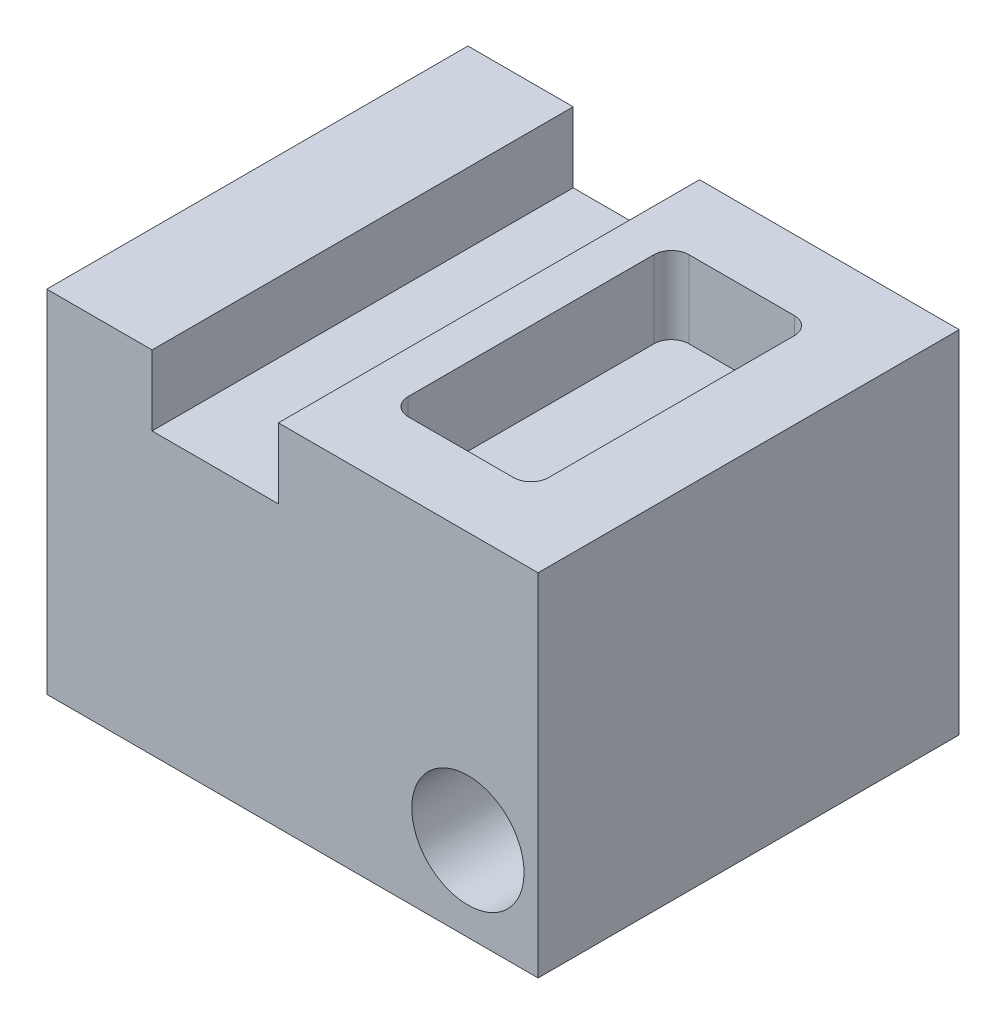
ISO-10303-21;
HEADER;
FILE_DESCRIPTION(('STEP AP214'),'2;1');
FILE_NAME('part.step','',(''),(''),'','','');
FILE_SCHEMA(('AUTOMOTIVE_DESIGN { 1 0 10303 214 1 1 1 1 }'));
ENDSEC;
DATA;
#1=APPLICATION_CONTEXT('core data for automotive mechanical design processes');
#2=APPLICATION_PROTOCOL_DEFINITION('international standard','automotive_design',2000,#1);
#3=PRODUCT_CONTEXT('',#1,'mechanical');
#4=PRODUCT('Part','Part','',(#3));
#5=PRODUCT_RELATED_PRODUCT_CATEGORY('part','',(#4));
#6=PRODUCT_DEFINITION_FORMATION('','',#4);
#7=PRODUCT_DEFINITION_CONTEXT('part definition',#1,'design');
#8=PRODUCT_DEFINITION('design','',#6,#7);
#9=PRODUCT_DEFINITION_SHAPE('','',#8);
#10=(LENGTH_UNIT() NAMED_UNIT(*) SI_UNIT(.MILLI.,.METRE.));
#11=(NAMED_UNIT(*) PLANE_ANGLE_UNIT() SI_UNIT($,.RADIAN.));
#12=(NAMED_UNIT(*) SI_UNIT($,.STERADIAN.) SOLID_ANGLE_UNIT());
#13=UNCERTAINTY_MEASURE_WITH_UNIT(LENGTH_MEASURE(1.E-05),#10,'distance_accuracy_value','');
#14=(GEOMETRIC_REPRESENTATION_CONTEXT(3) GLOBAL_UNCERTAINTY_ASSIGNED_CONTEXT((#13)) GLOBAL_UNIT_ASSIGNED_CONTEXT((#10,
#11,#12)) REPRESENTATION_CONTEXT('',''));
#15=CARTESIAN_POINT('',(0.,0.,0.));
#16=DIRECTION('',(0.,0.,1.));
#17=DIRECTION('',(1.,0.,0.));
#18=AXIS2_PLACEMENT_3D('',#15,#16,#17);
#19=CARTESIAN_POINT('',(0.,50.,-60.));
#20=DIRECTION('',(0.,1.,0.));
#21=DIRECTION('',(0.,0.,1.));
#22=AXIS2_PLACEMENT_3D('',#19,#20,#21);
#23=PLANE('',#22);
#24=DIRECTION('',(-1.,0.,0.));
#25=VECTOR('',#24,1.);
#26=CARTESIAN_POINT('',(0.,50.,0.));
#27=LINE('',#26,#25);
#28=CARTESIAN_POINT('',(15.,50.,0.));
#29=VERTEX_POINT('',#28);
#30=CARTESIAN_POINT('',(0.,50.,0.));
#31=VERTEX_POINT('',#30);
#32=EDGE_CURVE('E268',#29,#31,#27,.T.);
#33=ORIENTED_EDGE('',*,*,#32,.F.);
#34=DIRECTION('',(0.,0.,-1.));
#35=VECTOR('',#34,1.);
#36=CARTESIAN_POINT('',(15.,50.,0.999999999999999));
#37=LINE('',#36,#35);
#38=CARTESIAN_POINT('',(15.,50.,-60.));
#39=VERTEX_POINT('',#38);
#40=EDGE_CURVE('E50',#29,#39,#37,.T.);
#41=ORIENTED_EDGE('',*,*,#40,.T.);
#42=DIRECTION('',(-1.,0.,0.));
#43=VECTOR('',#42,1.);
#44=CARTESIAN_POINT('',(0.,50.,-60.));
#45=LINE('',#44,#43);
#46=CARTESIAN_POINT('',(0.,50.,-60.));
#47=VERTEX_POINT('',#46);
#48=EDGE_CURVE('E169',#39,#47,#45,.T.);
#49=ORIENTED_EDGE('',*,*,#48,.T.);
#50=DIRECTION('',(0.,0.,1.));
#51=VECTOR('',#50,1.);
#52=CARTESIAN_POINT('',(0.,50.,-60.));
#53=LINE('',#52,#51);
#54=EDGE_CURVE('E11',#47,#31,#53,.T.);
#55=ORIENTED_EDGE('',*,*,#54,.T.);
#56=EDGE_LOOP('',(#33,#41,#49,#55));
#57=FACE_BOUND('',#56,.T.);
#58=ADVANCED_FACE('F33',(#57),#23,.T.);
#59=CARTESIAN_POINT('',(0.,0.,-60.));
#60=DIRECTION('',(-1.,0.,0.));
#61=DIRECTION('',(0.,0.,1.));
#62=AXIS2_PLACEMENT_3D('',#59,#60,#61);
#63=PLANE('',#62);
#64=DIRECTION('',(0.,-1.,0.));
#65=VECTOR('',#64,1.);
#66=CARTESIAN_POINT('',(0.,0.,0.));
#67=LINE('',#66,#65);
#68=CARTESIAN_POINT('',(0.,0.,0.));
#69=VERTEX_POINT('',#68);
#70=EDGE_CURVE('E246',#31,#69,#67,.T.);
#71=ORIENTED_EDGE('',*,*,#70,.F.);
#72=ORIENTED_EDGE('',*,*,#54,.F.);
#73=DIRECTION('',(0.,-1.,0.));
#74=VECTOR('',#73,1.);
#75=CARTESIAN_POINT('',(0.,0.,-60.));
#76=LINE('',#75,#74);
#77=CARTESIAN_POINT('',(0.,0.,-60.));
#78=VERTEX_POINT('',#77);
#79=EDGE_CURVE('E247',#47,#78,#76,.T.);
#80=ORIENTED_EDGE('',*,*,#79,.T.);
#81=DIRECTION('',(0.,0.,1.));
#82=VECTOR('',#81,1.);
#83=CARTESIAN_POINT('',(0.,0.,-60.));
#84=LINE('',#83,#82);
#85=EDGE_CURVE('E37',#78,#69,#84,.T.);
#86=ORIENTED_EDGE('',*,*,#85,.T.);
#87=EDGE_LOOP('',(#71,#72,#80,#86));
#88=FACE_BOUND('',#87,.T.);
#89=ADVANCED_FACE('F35',(#88),#63,.T.);
#90=DIRECTION('',(0.,0.,-1.));
#91=VECTOR('',#90,1.);
#92=CARTESIAN_POINT('',(33.,50.,0.999999999999999));
#93=LINE('',#92,#91);
#94=CARTESIAN_POINT('',(33.,50.,0.));
#95=VERTEX_POINT('',#94);
#96=CARTESIAN_POINT('',(33.,50.,-60.));
#97=VERTEX_POINT('',#96);
#98=EDGE_CURVE('E174',#95,#97,#93,.T.);
#99=ORIENTED_EDGE('',*,*,#98,.F.);
#100=CARTESIAN_POINT('',(70.,50.,0.));
#101=VERTEX_POINT('',#100);
#102=EDGE_CURVE('E251',#101,#95,#27,.T.);
#103=ORIENTED_EDGE('',*,*,#102,.F.);
#104=DIRECTION('',(0.,0.,1.));
#105=VECTOR('',#104,1.);
#106=CARTESIAN_POINT('',(70.,50.,-60.));
#107=LINE('',#106,#105);
#108=CARTESIAN_POINT('',(70.,50.,-60.));
#109=VERTEX_POINT('',#108);
#110=EDGE_CURVE('E42',#109,#101,#107,.T.);
#111=ORIENTED_EDGE('',*,*,#110,.F.);
#112=EDGE_CURVE('E257',#109,#97,#45,.T.);
#113=ORIENTED_EDGE('',*,*,#112,.T.);
#114=EDGE_LOOP('',(#99,#103,#111,#113));
#115=FACE_BOUND('',#114,.T.);
#116=CARTESIAN_POINT('',(41.5,50.,-12.5));
#117=DIRECTION('',(0.,1.,0.));
#118=DIRECTION('',(0.,0.,1.));
#119=AXIS2_PLACEMENT_3D('',#116,#117,#118);
#120=CIRCLE('',#119,2.5);
#121=CARTESIAN_POINT('',(39.,50.,-12.5));
#122=VERTEX_POINT('',#121);
#123=CARTESIAN_POINT('',(41.5,50.,-10.));
#124=VERTEX_POINT('',#123);
#125=EDGE_CURVE('E58',#122,#124,#120,.T.);
#126=ORIENTED_EDGE('',*,*,#125,.F.);
#127=DIRECTION('',(0.,0.,1.));
#128=VECTOR('',#127,1.);
#129=CARTESIAN_POINT('',(39.,50.,-47.5));
#130=LINE('',#129,#128);
#131=CARTESIAN_POINT('',(39.,50.,-47.5));
#132=VERTEX_POINT('',#131);
#133=EDGE_CURVE('E182',#132,#122,#130,.T.);
#134=ORIENTED_EDGE('',*,*,#133,.F.);
#135=CARTESIAN_POINT('',(41.5,50.,-47.5));
#136=DIRECTION('',(0.,1.,0.));
#137=DIRECTION('',(0.,0.,1.));
#138=AXIS2_PLACEMENT_3D('',#135,#136,#137);
#139=CIRCLE('',#138,2.5);
#140=CARTESIAN_POINT('',(41.5,50.,-50.));
#141=VERTEX_POINT('',#140);
#142=EDGE_CURVE('E220',#141,#132,#139,.T.);
#143=ORIENTED_EDGE('',*,*,#142,.F.);
#144=DIRECTION('',(-1.,0.,0.));
#145=VECTOR('',#144,1.);
#146=CARTESIAN_POINT('',(41.5,50.,-50.));
#147=LINE('',#146,#145);
#148=CARTESIAN_POINT('',(56.5,50.,-50.));
#149=VERTEX_POINT('',#148);
#150=EDGE_CURVE('E217',#149,#141,#147,.T.);
#151=ORIENTED_EDGE('',*,*,#150,.F.);
#152=CARTESIAN_POINT('',(56.5,50.,-47.5));
#153=DIRECTION('',(0.,1.,0.));
#154=DIRECTION('',(0.,0.,-1.));
#155=AXIS2_PLACEMENT_3D('',#152,#153,#154);
#156=CIRCLE('',#155,2.5);
#157=CARTESIAN_POINT('',(59.,50.,-47.5));
#158=VERTEX_POINT('',#157);
#159=EDGE_CURVE('E214',#158,#149,#156,.T.);
#160=ORIENTED_EDGE('',*,*,#159,.F.);
#161=DIRECTION('',(0.,0.,-1.));
#162=VECTOR('',#161,1.);
#163=CARTESIAN_POINT('',(59.,50.,-47.5));
#164=LINE('',#163,#162);
#165=CARTESIAN_POINT('',(59.,50.,-12.5));
#166=VERTEX_POINT('',#165);
#167=EDGE_CURVE('E211',#166,#158,#164,.T.);
#168=ORIENTED_EDGE('',*,*,#167,.F.);
#169=CARTESIAN_POINT('',(56.5,50.,-12.5));
#170=DIRECTION('',(0.,1.,0.));
#171=DIRECTION('',(0.,0.,1.));
#172=AXIS2_PLACEMENT_3D('',#169,#170,#171);
#173=CIRCLE('',#172,2.5);
#174=CARTESIAN_POINT('',(56.5,50.,-10.));
#175=VERTEX_POINT('',#174);
#176=EDGE_CURVE('E208',#175,#166,#173,.T.);
#177=ORIENTED_EDGE('',*,*,#176,.F.);
#178=DIRECTION('',(1.,0.,0.));
#179=VECTOR('',#178,1.);
#180=CARTESIAN_POINT('',(41.5,50.,-10.));
#181=LINE('',#180,#179);
#182=EDGE_CURVE('E205',#124,#175,#181,.T.);
#183=ORIENTED_EDGE('',*,*,#182,.F.);
#184=EDGE_LOOP('',(#126,#134,#143,#151,#160,#168,#177,#183));
#185=FACE_BOUND('',#184,.T.);
#186=ADVANCED_FACE('F292',(#115,#185),#23,.T.);
#187=CARTESIAN_POINT('',(70.,0.,-60.));
#188=DIRECTION('',(1.,0.,0.));
#189=DIRECTION('',(0.,0.,-1.));
#190=AXIS2_PLACEMENT_3D('',#187,#188,#189);
#191=PLANE('',#190);
#192=DIRECTION('',(0.,1.,0.));
#193=VECTOR('',#192,1.);
#194=CARTESIAN_POINT('',(70.,0.,0.));
#195=LINE('',#194,#193);
#196=CARTESIAN_POINT('',(70.,0.,0.));
#197=VERTEX_POINT('',#196);
#198=EDGE_CURVE('E265',#197,#101,#195,.T.);
#199=ORIENTED_EDGE('',*,*,#198,.F.);
#200=DIRECTION('',(0.,0.,1.));
#201=VECTOR('',#200,1.);
#202=CARTESIAN_POINT('',(70.,0.,-60.));
#203=LINE('',#202,#201);
#204=CARTESIAN_POINT('',(70.,0.,-60.));
#205=VERTEX_POINT('',#204);
#206=EDGE_CURVE('E271',#205,#197,#203,.T.);
#207=ORIENTED_EDGE('',*,*,#206,.F.);
#208=DIRECTION('',(0.,1.,0.));
#209=VECTOR('',#208,1.);
#210=CARTESIAN_POINT('',(70.,0.,-60.));
#211=LINE('',#210,#209);
#212=EDGE_CURVE('E254',#205,#109,#211,.T.);
#213=ORIENTED_EDGE('',*,*,#212,.T.);
#214=ORIENTED_EDGE('',*,*,#110,.T.);
#215=EDGE_LOOP('',(#199,#207,#213,#214));
#216=FACE_BOUND('',#215,.T.);
#217=ADVANCED_FACE('F287',(#216),#191,.T.);
#218=CARTESIAN_POINT('',(0.,0.,-60.));
#219=DIRECTION('',(0.,-1.,0.));
#220=DIRECTION('',(0.,0.,-1.));
#221=AXIS2_PLACEMENT_3D('',#218,#219,#220);
#222=PLANE('',#221);
#223=DIRECTION('',(1.,0.,0.));
#224=VECTOR('',#223,1.);
#225=CARTESIAN_POINT('',(0.,0.,0.));
#226=LINE('',#225,#224);
#227=EDGE_CURVE('E262',#69,#197,#226,.T.);
#228=ORIENTED_EDGE('',*,*,#227,.F.);
#229=ORIENTED_EDGE('',*,*,#85,.F.);
#230=DIRECTION('',(1.,0.,0.));
#231=VECTOR('',#230,1.);
#232=CARTESIAN_POINT('',(0.,0.,-60.));
#233=LINE('',#232,#231);
#234=EDGE_CURVE('E250',#78,#205,#233,.T.);
#235=ORIENTED_EDGE('',*,*,#234,.T.);
#236=ORIENTED_EDGE('',*,*,#206,.T.);
#237=EDGE_LOOP('',(#228,#229,#235,#236));
#238=FACE_BOUND('',#237,.T.);
#239=ADVANCED_FACE('F279',(#238),#222,.T.);
#240=CARTESIAN_POINT('',(0.,0.,-60.));
#241=DIRECTION('',(0.,0.,-1.));
#242=DIRECTION('',(-1.,0.,0.));
#243=AXIS2_PLACEMENT_3D('',#240,#241,#242);
#244=PLANE('',#243);
#245=DIRECTION('',(0.,1.,0.));
#246=VECTOR('',#245,1.);
#247=CARTESIAN_POINT('',(15.,50.,-60.));
#248=LINE('',#247,#246);
#249=CARTESIAN_POINT('',(15.,40.,-60.));
#250=VERTEX_POINT('',#249);
#251=EDGE_CURVE('E150',#250,#39,#248,.T.);
#252=ORIENTED_EDGE('',*,*,#251,.F.);
#253=DIRECTION('',(-1.,0.,0.));
#254=VECTOR('',#253,1.);
#255=CARTESIAN_POINT('',(15.,40.,-60.));
#256=LINE('',#255,#254);
#257=CARTESIAN_POINT('',(33.,40.,-60.));
#258=VERTEX_POINT('',#257);
#259=EDGE_CURVE('E157',#258,#250,#256,.T.);
#260=ORIENTED_EDGE('',*,*,#259,.F.);
#261=DIRECTION('',(0.,-1.,0.));
#262=VECTOR('',#261,1.);
#263=CARTESIAN_POINT('',(33.,50.,-60.));
#264=LINE('',#263,#262);
#265=EDGE_CURVE('E164',#97,#258,#264,.T.);
#266=ORIENTED_EDGE('',*,*,#265,.F.);
#267=ORIENTED_EDGE('',*,*,#112,.F.);
#268=ORIENTED_EDGE('',*,*,#212,.F.);
#269=ORIENTED_EDGE('',*,*,#234,.F.);
#270=ORIENTED_EDGE('',*,*,#79,.F.);
#271=ORIENTED_EDGE('',*,*,#48,.F.);
#272=EDGE_LOOP('',(#252,#260,#266,#267,#268,#269,#270,#271));
#273=FACE_BOUND('',#272,.T.);
#274=ADVANCED_FACE('F167',(#273),#244,.T.);
#275=CARTESIAN_POINT('',(0.,0.,0.));
#276=DIRECTION('',(0.,0.,-1.));
#277=DIRECTION('',(-1.,0.,0.));
#278=AXIS2_PLACEMENT_3D('',#275,#276,#277);
#279=PLANE('',#278);
#280=CARTESIAN_POINT('',(60.,12.,0.));
#281=DIRECTION('',(0.,0.,1.));
#282=DIRECTION('',(1.,0.,0.));
#283=AXIS2_PLACEMENT_3D('',#280,#281,#282);
#284=CIRCLE('',#283,7.99999999999998);
#285=CARTESIAN_POINT('',(68.,12.,0.));
#286=VERTEX_POINT('',#285);
#287=EDGE_CURVE('E227',#286,#286,#284,.T.);
#288=ORIENTED_EDGE('',*,*,#287,.F.);
#289=EDGE_LOOP('',(#288));
#290=FACE_BOUND('',#289,.T.);
#291=ORIENTED_EDGE('',*,*,#102,.T.);
#292=DIRECTION('',(0.,-1.,0.));
#293=VECTOR('',#292,1.);
#294=CARTESIAN_POINT('',(33.,50.,0.));
#295=LINE('',#294,#293);
#296=CARTESIAN_POINT('',(33.,40.,0.));
#297=VERTEX_POINT('',#296);
#298=EDGE_CURVE('E176',#95,#297,#295,.T.);
#299=ORIENTED_EDGE('',*,*,#298,.T.);
#300=DIRECTION('',(-1.,0.,0.));
#301=VECTOR('',#300,1.);
#302=CARTESIAN_POINT('',(15.,40.,0.));
#303=LINE('',#302,#301);
#304=CARTESIAN_POINT('',(15.,40.,0.));
#305=VERTEX_POINT('',#304);
#306=EDGE_CURVE('E154',#297,#305,#303,.T.);
#307=ORIENTED_EDGE('',*,*,#306,.T.);
#308=DIRECTION('',(0.,1.,0.));
#309=VECTOR('',#308,1.);
#310=CARTESIAN_POINT('',(15.,50.,0.));
#311=LINE('',#310,#309);
#312=EDGE_CURVE('E151',#305,#29,#311,.T.);
#313=ORIENTED_EDGE('',*,*,#312,.T.);
#314=ORIENTED_EDGE('',*,*,#32,.T.);
#315=ORIENTED_EDGE('',*,*,#70,.T.);
#316=ORIENTED_EDGE('',*,*,#227,.T.);
#317=ORIENTED_EDGE('',*,*,#198,.T.);
#318=EDGE_LOOP('',(#291,#299,#307,#313,#314,#315,#316,#317));
#319=FACE_BOUND('',#318,.T.);
#320=ADVANCED_FACE('F281',(#290,#319),#279,.F.);
#321=CARTESIAN_POINT('',(60.,12.,-22.));
#322=DIRECTION('',(0.,0.,-1.));
#323=DIRECTION('',(-1.,0.,0.));
#324=AXIS2_PLACEMENT_3D('',#321,#322,#323);
#325=PLANE('',#324);
#326=CARTESIAN_POINT('',(60.,12.,-22.));
#327=DIRECTION('',(0.,0.,1.));
#328=DIRECTION('',(1.,0.,0.));
#329=AXIS2_PLACEMENT_3D('',#326,#327,#328);
#330=CIRCLE('',#329,7.99999999999998);
#331=CARTESIAN_POINT('',(68.,12.,-22.));
#332=VERTEX_POINT('',#331);
#333=EDGE_CURVE('E243',#332,#332,#330,.T.);
#334=ORIENTED_EDGE('',*,*,#333,.T.);
#335=EDGE_LOOP('',(#334));
#336=FACE_BOUND('',#335,.T.);
#337=ADVANCED_FACE('F331',(#336),#325,.F.);
#338=CARTESIAN_POINT('',(60.,12.,0.));
#339=DIRECTION('',(0.,0.,1.));
#340=DIRECTION('',(1.,0.,0.));
#341=AXIS2_PLACEMENT_3D('',#338,#339,#340);
#342=CYLINDRICAL_SURFACE('',#341,7.99999999999998);
#343=ORIENTED_EDGE('',*,*,#333,.F.);
#344=EDGE_LOOP('',(#343));
#345=FACE_BOUND('',#344,.T.);
#346=ORIENTED_EDGE('',*,*,#287,.T.);
#347=EDGE_LOOP('',(#346));
#348=FACE_BOUND('',#347,.T.);
#349=ADVANCED_FACE('F336',(#345,#348),#342,.F.);
#350=CARTESIAN_POINT('',(41.5,39.,-12.5));
#351=DIRECTION('',(0.,1.,0.));
#352=DIRECTION('',(0.,0.,1.));
#353=AXIS2_PLACEMENT_3D('',#350,#351,#352);
#354=CYLINDRICAL_SURFACE('',#353,2.5);
#355=ORIENTED_EDGE('',*,*,#125,.T.);
#356=DIRECTION('',(0.,1.,0.));
#357=VECTOR('',#356,1.);
#358=CARTESIAN_POINT('',(41.5,39.,-10.));
#359=LINE('',#358,#357);
#360=CARTESIAN_POINT('',(41.5,39.,-10.));
#361=VERTEX_POINT('',#360);
#362=EDGE_CURVE('E203',#361,#124,#359,.T.);
#363=ORIENTED_EDGE('',*,*,#362,.F.);
#364=CARTESIAN_POINT('',(41.5,39.,-12.5));
#365=DIRECTION('',(0.,1.,0.));
#366=DIRECTION('',(0.,0.,1.));
#367=AXIS2_PLACEMENT_3D('',#364,#365,#366);
#368=CIRCLE('',#367,2.5);
#369=CARTESIAN_POINT('',(39.,39.,-12.5));
#370=VERTEX_POINT('',#369);
#371=EDGE_CURVE('E178',#370,#361,#368,.T.);
#372=ORIENTED_EDGE('',*,*,#371,.F.);
#373=DIRECTION('',(0.,1.,0.));
#374=VECTOR('',#373,1.);
#375=CARTESIAN_POINT('',(39.,39.,-12.5));
#376=LINE('',#375,#374);
#377=EDGE_CURVE('E225',#370,#122,#376,.T.);
#378=ORIENTED_EDGE('',*,*,#377,.T.);
#379=EDGE_LOOP('',(#355,#363,#372,#378));
#380=FACE_BOUND('',#379,.T.);
#381=ADVANCED_FACE('F340',(#380),#354,.F.);
#382=CARTESIAN_POINT('',(39.,39.,-47.5));
#383=DIRECTION('',(-1.,0.,0.));
#384=DIRECTION('',(0.,0.,1.));
#385=AXIS2_PLACEMENT_3D('',#382,#383,#384);
#386=PLANE('',#385);
#387=ORIENTED_EDGE('',*,*,#133,.T.);
#388=ORIENTED_EDGE('',*,*,#377,.F.);
#389=DIRECTION('',(0.,0.,1.));
#390=VECTOR('',#389,1.);
#391=CARTESIAN_POINT('',(39.,39.,-47.5));
#392=LINE('',#391,#390);
#393=CARTESIAN_POINT('',(39.,39.,-47.5));
#394=VERTEX_POINT('',#393);
#395=EDGE_CURVE('E200',#394,#370,#392,.T.);
#396=ORIENTED_EDGE('',*,*,#395,.F.);
#397=DIRECTION('',(0.,1.,0.));
#398=VECTOR('',#397,1.);
#399=CARTESIAN_POINT('',(39.,39.,-47.5));
#400=LINE('',#399,#398);
#401=EDGE_CURVE('E228',#394,#132,#400,.T.);
#402=ORIENTED_EDGE('',*,*,#401,.T.);
#403=EDGE_LOOP('',(#387,#388,#396,#402));
#404=FACE_BOUND('',#403,.T.);
#405=ADVANCED_FACE('F344',(#404),#386,.F.);
#406=CARTESIAN_POINT('',(41.5,39.,-47.5));
#407=DIRECTION('',(0.,1.,0.));
#408=DIRECTION('',(0.,0.,1.));
#409=AXIS2_PLACEMENT_3D('',#406,#407,#408);
#410=CYLINDRICAL_SURFACE('',#409,2.5);
#411=ORIENTED_EDGE('',*,*,#142,.T.);
#412=ORIENTED_EDGE('',*,*,#401,.F.);
#413=CARTESIAN_POINT('',(41.5,39.,-47.5));
#414=DIRECTION('',(0.,1.,0.));
#415=DIRECTION('',(0.,0.,1.));
#416=AXIS2_PLACEMENT_3D('',#413,#414,#415);
#417=CIRCLE('',#416,2.5);
#418=CARTESIAN_POINT('',(41.5,39.,-50.));
#419=VERTEX_POINT('',#418);
#420=EDGE_CURVE('E197',#419,#394,#417,.T.);
#421=ORIENTED_EDGE('',*,*,#420,.F.);
#422=DIRECTION('',(0.,1.,0.));
#423=VECTOR('',#422,1.);
#424=CARTESIAN_POINT('',(41.5,39.,-50.));
#425=LINE('',#424,#423);
#426=EDGE_CURVE('E230',#419,#141,#425,.T.);
#427=ORIENTED_EDGE('',*,*,#426,.T.);
#428=EDGE_LOOP('',(#411,#412,#421,#427));
#429=FACE_BOUND('',#428,.T.);
#430=ADVANCED_FACE('F363',(#429),#410,.F.);
#431=CARTESIAN_POINT('',(41.5,39.,-50.));
#432=DIRECTION('',(0.,0.,-1.));
#433=DIRECTION('',(-1.,0.,0.));
#434=AXIS2_PLACEMENT_3D('',#431,#432,#433);
#435=PLANE('',#434);
#436=ORIENTED_EDGE('',*,*,#150,.T.);
#437=ORIENTED_EDGE('',*,*,#426,.F.);
#438=DIRECTION('',(-1.,0.,0.));
#439=VECTOR('',#438,1.);
#440=CARTESIAN_POINT('',(41.5,39.,-50.));
#441=LINE('',#440,#439);
#442=CARTESIAN_POINT('',(56.5,39.,-50.));
#443=VERTEX_POINT('',#442);
#444=EDGE_CURVE('E194',#443,#419,#441,.T.);
#445=ORIENTED_EDGE('',*,*,#444,.F.);
#446=DIRECTION('',(0.,1.,0.));
#447=VECTOR('',#446,1.);
#448=CARTESIAN_POINT('',(56.5,39.,-50.));
#449=LINE('',#448,#447);
#450=EDGE_CURVE('E232',#443,#149,#449,.T.);
#451=ORIENTED_EDGE('',*,*,#450,.T.);
#452=EDGE_LOOP('',(#436,#437,#445,#451));
#453=FACE_BOUND('',#452,.T.);
#454=ADVANCED_FACE('F359',(#453),#435,.F.);
#455=CARTESIAN_POINT('',(56.5,39.,-47.5));
#456=DIRECTION('',(0.,1.,0.));
#457=DIRECTION('',(0.,0.,1.));
#458=AXIS2_PLACEMENT_3D('',#455,#456,#457);
#459=CYLINDRICAL_SURFACE('',#458,2.5);
#460=ORIENTED_EDGE('',*,*,#159,.T.);
#461=ORIENTED_EDGE('',*,*,#450,.F.);
#462=CARTESIAN_POINT('',(56.5,39.,-47.5));
#463=DIRECTION('',(0.,1.,0.));
#464=DIRECTION('',(0.,0.,-1.));
#465=AXIS2_PLACEMENT_3D('',#462,#463,#464);
#466=CIRCLE('',#465,2.5);
#467=CARTESIAN_POINT('',(59.,39.,-47.5));
#468=VERTEX_POINT('',#467);
#469=EDGE_CURVE('E191',#468,#443,#466,.T.);
#470=ORIENTED_EDGE('',*,*,#469,.F.);
#471=DIRECTION('',(0.,1.,0.));
#472=VECTOR('',#471,1.);
#473=CARTESIAN_POINT('',(59.,39.,-47.5));
#474=LINE('',#473,#472);
#475=EDGE_CURVE('E234',#468,#158,#474,.T.);
#476=ORIENTED_EDGE('',*,*,#475,.T.);
#477=EDGE_LOOP('',(#460,#461,#470,#476));
#478=FACE_BOUND('',#477,.T.);
#479=ADVANCED_FACE('F355',(#478),#459,.F.);
#480=CARTESIAN_POINT('',(59.,39.,-47.5));
#481=DIRECTION('',(1.,0.,0.));
#482=DIRECTION('',(0.,0.,-1.));
#483=AXIS2_PLACEMENT_3D('',#480,#481,#482);
#484=PLANE('',#483);
#485=ORIENTED_EDGE('',*,*,#167,.T.);
#486=ORIENTED_EDGE('',*,*,#475,.F.);
#487=DIRECTION('',(0.,0.,-1.));
#488=VECTOR('',#487,1.);
#489=CARTESIAN_POINT('',(59.,39.,-47.5));
#490=LINE('',#489,#488);
#491=CARTESIAN_POINT('',(59.,39.,-12.5));
#492=VERTEX_POINT('',#491);
#493=EDGE_CURVE('E188',#492,#468,#490,.T.);
#494=ORIENTED_EDGE('',*,*,#493,.F.);
#495=DIRECTION('',(0.,1.,0.));
#496=VECTOR('',#495,1.);
#497=CARTESIAN_POINT('',(59.,39.,-12.5));
#498=LINE('',#497,#496);
#499=EDGE_CURVE('E236',#492,#166,#498,.T.);
#500=ORIENTED_EDGE('',*,*,#499,.T.);
#501=EDGE_LOOP('',(#485,#486,#494,#500));
#502=FACE_BOUND('',#501,.T.);
#503=ADVANCED_FACE('F351',(#502),#484,.F.);
#504=CARTESIAN_POINT('',(56.5,39.,-12.5));
#505=DIRECTION('',(0.,1.,0.));
#506=DIRECTION('',(0.,0.,1.));
#507=AXIS2_PLACEMENT_3D('',#504,#505,#506);
#508=CYLINDRICAL_SURFACE('',#507,2.5);
#509=ORIENTED_EDGE('',*,*,#176,.T.);
#510=ORIENTED_EDGE('',*,*,#499,.F.);
#511=CARTESIAN_POINT('',(56.5,39.,-12.5));
#512=DIRECTION('',(0.,1.,0.));
#513=DIRECTION('',(0.,0.,1.));
#514=AXIS2_PLACEMENT_3D('',#511,#512,#513);
#515=CIRCLE('',#514,2.5);
#516=CARTESIAN_POINT('',(56.5,39.,-10.));
#517=VERTEX_POINT('',#516);
#518=EDGE_CURVE('E185',#517,#492,#515,.T.);
#519=ORIENTED_EDGE('',*,*,#518,.F.);
#520=DIRECTION('',(0.,1.,0.));
#521=VECTOR('',#520,1.);
#522=CARTESIAN_POINT('',(56.5,39.,-10.));
#523=LINE('',#522,#521);
#524=EDGE_CURVE('E238',#517,#175,#523,.T.);
#525=ORIENTED_EDGE('',*,*,#524,.T.);
#526=EDGE_LOOP('',(#509,#510,#519,#525));
#527=FACE_BOUND('',#526,.T.);
#528=ADVANCED_FACE('F347',(#527),#508,.F.);
#529=CARTESIAN_POINT('',(41.5,39.,-10.));
#530=DIRECTION('',(0.,0.,1.));
#531=DIRECTION('',(1.,0.,0.));
#532=AXIS2_PLACEMENT_3D('',#529,#530,#531);
#533=PLANE('',#532);
#534=ORIENTED_EDGE('',*,*,#182,.T.);
#535=ORIENTED_EDGE('',*,*,#524,.F.);
#536=DIRECTION('',(1.,0.,0.));
#537=VECTOR('',#536,1.);
#538=CARTESIAN_POINT('',(41.5,39.,-10.));
#539=LINE('',#538,#537);
#540=EDGE_CURVE('E181',#361,#517,#539,.T.);
#541=ORIENTED_EDGE('',*,*,#540,.F.);
#542=ORIENTED_EDGE('',*,*,#362,.T.);
#543=EDGE_LOOP('',(#534,#535,#541,#542));
#544=FACE_BOUND('',#543,.T.);
#545=ADVANCED_FACE('F307',(#544),#533,.F.);
#546=CARTESIAN_POINT('',(41.5,39.,-12.5));
#547=DIRECTION('',(0.,1.,0.));
#548=DIRECTION('',(0.,0.,1.));
#549=AXIS2_PLACEMENT_3D('',#546,#547,#548);
#550=PLANE('',#549);
#551=ORIENTED_EDGE('',*,*,#371,.T.);
#552=ORIENTED_EDGE('',*,*,#540,.T.);
#553=ORIENTED_EDGE('',*,*,#518,.T.);
#554=ORIENTED_EDGE('',*,*,#493,.T.);
#555=ORIENTED_EDGE('',*,*,#469,.T.);
#556=ORIENTED_EDGE('',*,*,#444,.T.);
#557=ORIENTED_EDGE('',*,*,#420,.T.);
#558=ORIENTED_EDGE('',*,*,#395,.T.);
#559=EDGE_LOOP('',(#551,#552,#553,#554,#555,#556,#557,#558));
#560=FACE_BOUND('',#559,.T.);
#561=ADVANCED_FACE('F300',(#560),#550,.T.);
#562=CARTESIAN_POINT('',(33.,50.,0.999999999999999));
#563=DIRECTION('',(-1.,0.,0.));
#564=DIRECTION('',(0.,0.,1.));
#565=AXIS2_PLACEMENT_3D('',#562,#563,#564);
#566=PLANE('',#565);
#567=ORIENTED_EDGE('',*,*,#265,.T.);
#568=DIRECTION('',(0.,0.,-1.));
#569=VECTOR('',#568,1.);
#570=CARTESIAN_POINT('',(33.,40.,0.999999999999999));
#571=LINE('',#570,#569);
#572=EDGE_CURVE('E160',#297,#258,#571,.T.);
#573=ORIENTED_EDGE('',*,*,#572,.F.);
#574=ORIENTED_EDGE('',*,*,#298,.F.);
#575=ORIENTED_EDGE('',*,*,#98,.T.);
#576=EDGE_LOOP('',(#567,#573,#574,#575));
#577=FACE_BOUND('',#576,.T.);
#578=ADVANCED_FACE('F295',(#577),#566,.T.);
#579=CARTESIAN_POINT('',(15.,40.,0.999999999999999));
#580=DIRECTION('',(0.,1.,0.));
#581=DIRECTION('',(0.,0.,1.));
#582=AXIS2_PLACEMENT_3D('',#579,#580,#581);
#583=PLANE('',#582);
#584=ORIENTED_EDGE('',*,*,#259,.T.);
#585=DIRECTION('',(0.,0.,-1.));
#586=VECTOR('',#585,1.);
#587=CARTESIAN_POINT('',(15.,40.,0.999999999999999));
#588=LINE('',#587,#586);
#589=EDGE_CURVE('E146',#305,#250,#588,.T.);
#590=ORIENTED_EDGE('',*,*,#589,.F.);
#591=ORIENTED_EDGE('',*,*,#306,.F.);
#592=ORIENTED_EDGE('',*,*,#572,.T.);
#593=EDGE_LOOP('',(#584,#590,#591,#592));
#594=FACE_BOUND('',#593,.T.);
#595=ADVANCED_FACE('F158',(#594),#583,.T.);
#596=CARTESIAN_POINT('',(15.,50.,0.999999999999999));
#597=DIRECTION('',(1.,0.,0.));
#598=DIRECTION('',(0.,0.,-1.));
#599=AXIS2_PLACEMENT_3D('',#596,#597,#598);
#600=PLANE('',#599);
#601=ORIENTED_EDGE('',*,*,#251,.T.);
#602=ORIENTED_EDGE('',*,*,#40,.F.);
#603=ORIENTED_EDGE('',*,*,#312,.F.);
#604=ORIENTED_EDGE('',*,*,#589,.T.);
#605=EDGE_LOOP('',(#601,#602,#603,#604));
#606=FACE_BOUND('',#605,.T.);
#607=ADVANCED_FACE('F148',(#606),#600,.T.);
#608=CLOSED_SHELL('',(#58,#89,#186,#217,#239,#274,#320,#337,#349,#381,#405,#430,#454,#479,#503,
#528,#545,#561,#578,#595,#607));
#609=MANIFOLD_SOLID_BREP('B2',#608);
#610=ADVANCED_BREP_SHAPE_REPRESENTATION('',(#18,#609),#14);
#611=SHAPE_DEFINITION_REPRESENTATION(#9,#610);
ENDSEC;
END-ISO-10303-21;
